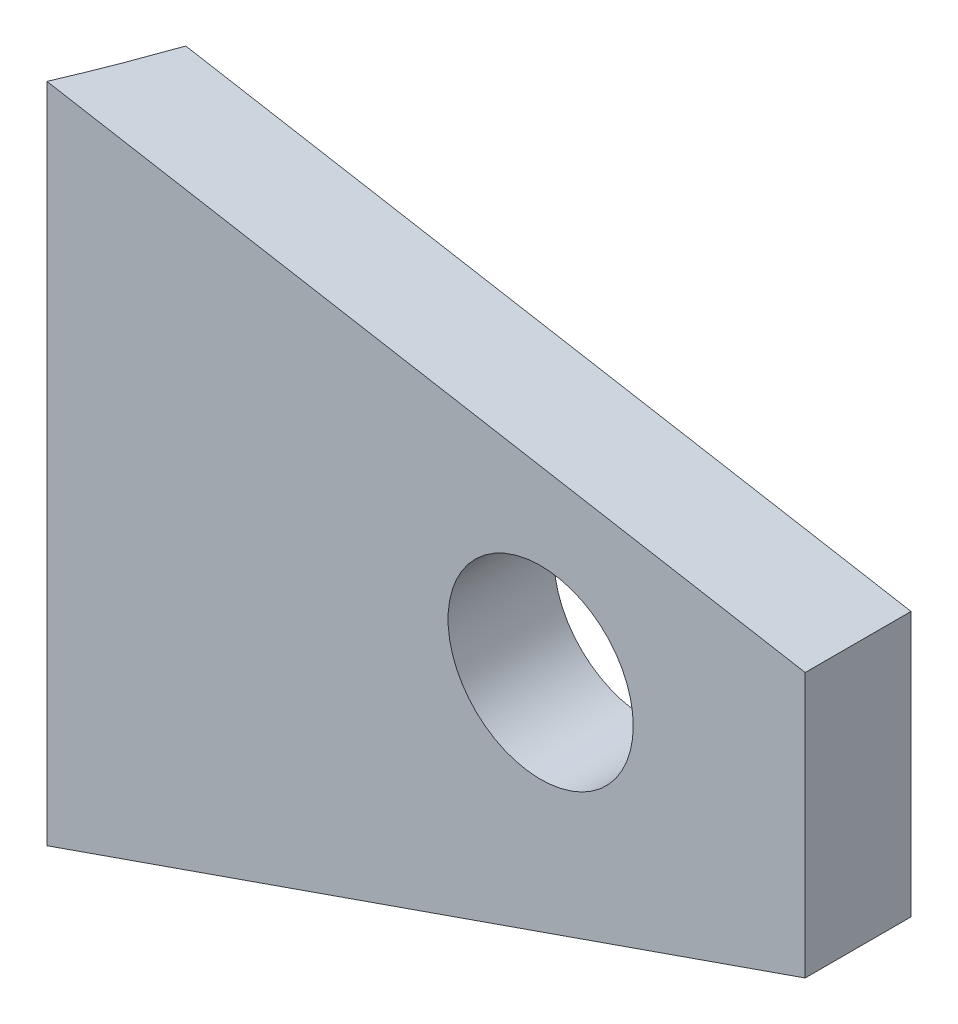
ISO-10303-21;
HEADER;
FILE_DESCRIPTION(('STEP AP214'),'2;1');
FILE_NAME('part.step','',(''),(''),'','','');
FILE_SCHEMA(('AUTOMOTIVE_DESIGN { 1 0 10303 214 1 1 1 1 }'));
ENDSEC;
DATA;
#1=APPLICATION_CONTEXT('core data for automotive mechanical design processes');
#2=APPLICATION_PROTOCOL_DEFINITION('international standard','automotive_design',2000,#1);
#3=PRODUCT_CONTEXT('',#1,'mechanical');
#4=PRODUCT('Part','Part','',(#3));
#5=PRODUCT_RELATED_PRODUCT_CATEGORY('part','',(#4));
#6=PRODUCT_DEFINITION_FORMATION('','',#4);
#7=PRODUCT_DEFINITION_CONTEXT('part definition',#1,'design');
#8=PRODUCT_DEFINITION('design','',#6,#7);
#9=PRODUCT_DEFINITION_SHAPE('','',#8);
#10=(LENGTH_UNIT() NAMED_UNIT(*) SI_UNIT(.MILLI.,.METRE.));
#11=(NAMED_UNIT(*) PLANE_ANGLE_UNIT() SI_UNIT($,.RADIAN.));
#12=(NAMED_UNIT(*) SI_UNIT($,.STERADIAN.) SOLID_ANGLE_UNIT());
#13=UNCERTAINTY_MEASURE_WITH_UNIT(LENGTH_MEASURE(1.E-05),#10,'distance_accuracy_value','');
#14=(GEOMETRIC_REPRESENTATION_CONTEXT(3) GLOBAL_UNCERTAINTY_ASSIGNED_CONTEXT((#13)) GLOBAL_UNIT_ASSIGNED_CONTEXT((#10,
#11,#12)) REPRESENTATION_CONTEXT('',''));
#15=CARTESIAN_POINT('',(0.,0.,0.));
#16=DIRECTION('',(0.,0.,1.));
#17=DIRECTION('',(1.,0.,0.));
#18=AXIS2_PLACEMENT_3D('',#15,#16,#17);
#19=CARTESIAN_POINT('',(0.,0.,2.));
#20=DIRECTION('',(0.,0.,1.));
#21=DIRECTION('',(1.,0.,0.));
#22=AXIS2_PLACEMENT_3D('',#19,#20,#21);
#23=PLANE('',#22);
#24=DIRECTION('',(-0.98500419469347,0.172530392789993,0.));
#25=VECTOR('',#24,1.);
#26=CARTESIAN_POINT('',(5.,2.5,2.));
#27=LINE('',#26,#25);
#28=CARTESIAN_POINT('',(5.,2.5,2.));
#29=VERTEX_POINT('',#28);
#30=CARTESIAN_POINT('',(-9.33000000000001,5.01,2.00000000000002));
#31=VERTEX_POINT('',#30);
#32=EDGE_CURVE('E78',#29,#31,#27,.T.);
#33=ORIENTED_EDGE('',*,*,#32,.T.);
#34=DIRECTION('',(0.,-1.,0.));
#35=VECTOR('',#34,1.);
#36=CARTESIAN_POINT('',(-9.33,5.01,2.));
#37=LINE('',#36,#35);
#38=CARTESIAN_POINT('',(-9.33,-7.5,2.));
#39=VERTEX_POINT('',#38);
#40=EDGE_CURVE('E98',#31,#39,#37,.T.);
#41=ORIENTED_EDGE('',*,*,#40,.T.);
#42=DIRECTION('',(0.944176352519815,0.329440457962252,0.));
#43=VECTOR('',#42,1.);
#44=CARTESIAN_POINT('',(-9.33,-7.5,2.));
#45=LINE('',#44,#43);
#46=CARTESIAN_POINT('',(5.,-2.5,2.));
#47=VERTEX_POINT('',#46);
#48=EDGE_CURVE('E96',#39,#47,#45,.T.);
#49=ORIENTED_EDGE('',*,*,#48,.T.);
#50=DIRECTION('',(0.,1.,0.));
#51=VECTOR('',#50,1.);
#52=CARTESIAN_POINT('',(5.,-2.5,2.));
#53=LINE('',#52,#51);
#54=EDGE_CURVE('E56',#47,#29,#53,.T.);
#55=ORIENTED_EDGE('',*,*,#54,.T.);
#56=EDGE_LOOP('',(#33,#41,#49,#55));
#57=FACE_BOUND('',#56,.T.);
#58=CARTESIAN_POINT('',(0.,0.,2.));
#59=DIRECTION('',(0.,0.,1.));
#60=DIRECTION('',(1.,0.,0.));
#61=AXIS2_PLACEMENT_3D('',#58,#59,#60);
#62=CIRCLE('',#61,1.75);
#63=CARTESIAN_POINT('',(1.75,0.,2.));
#64=VERTEX_POINT('',#63);
#65=EDGE_CURVE('E88',#64,#64,#62,.T.);
#66=ORIENTED_EDGE('',*,*,#65,.F.);
#67=EDGE_LOOP('',(#66));
#68=FACE_BOUND('',#67,.T.);
#69=ADVANCED_FACE('F33',(#57,#68),#23,.T.);
#70=CARTESIAN_POINT('',(0.,0.,0.));
#71=DIRECTION('',(0.,0.,1.));
#72=DIRECTION('',(1.,0.,0.));
#73=AXIS2_PLACEMENT_3D('',#70,#71,#72);
#74=PLANE('',#73);
#75=DIRECTION('',(0.944176352519815,0.329440457962252,0.));
#76=VECTOR('',#75,1.);
#77=CARTESIAN_POINT('',(-9.33,-7.5,0.));
#78=LINE('',#77,#76);
#79=CARTESIAN_POINT('',(-8.70697373888624,-7.28261470303079,0.));
#80=VERTEX_POINT('',#79);
#81=CARTESIAN_POINT('',(5.,-2.5,0.));
#82=VERTEX_POINT('',#81);
#83=EDGE_CURVE('E79',#80,#82,#78,.T.);
#84=ORIENTED_EDGE('',*,*,#83,.F.);
#85=DIRECTION('',(0.,1.,0.));
#86=VECTOR('',#85,1.);
#87=CARTESIAN_POINT('',(-8.70697373888624,-7.5,0.));
#88=LINE('',#87,#86);
#89=CARTESIAN_POINT('',(-8.70697373888624,4.90087258092145,0.));
#90=VERTEX_POINT('',#89);
#91=EDGE_CURVE('E48',#80,#90,#88,.T.);
#92=ORIENTED_EDGE('',*,*,#91,.T.);
#93=DIRECTION('',(-0.98500419469347,0.172530392789993,0.));
#94=VECTOR('',#93,1.);
#95=CARTESIAN_POINT('',(5.,2.5,0.));
#96=LINE('',#95,#94);
#97=CARTESIAN_POINT('',(5.,2.5,0.));
#98=VERTEX_POINT('',#97);
#99=EDGE_CURVE('E84',#98,#90,#96,.T.);
#100=ORIENTED_EDGE('',*,*,#99,.F.);
#101=DIRECTION('',(0.,1.,0.));
#102=VECTOR('',#101,1.);
#103=CARTESIAN_POINT('',(5.,-2.5,0.));
#104=LINE('',#103,#102);
#105=EDGE_CURVE('E69',#82,#98,#104,.T.);
#106=ORIENTED_EDGE('',*,*,#105,.F.);
#107=EDGE_LOOP('',(#84,#92,#100,#106));
#108=FACE_BOUND('',#107,.T.);
#109=CARTESIAN_POINT('',(0.,0.,0.));
#110=DIRECTION('',(0.,0.,1.));
#111=DIRECTION('',(1.,0.,0.));
#112=AXIS2_PLACEMENT_3D('',#109,#110,#111);
#113=CIRCLE('',#112,1.75);
#114=CARTESIAN_POINT('',(1.75,0.,0.));
#115=VERTEX_POINT('',#114);
#116=EDGE_CURVE('E92',#115,#115,#113,.T.);
#117=ORIENTED_EDGE('',*,*,#116,.T.);
#118=EDGE_LOOP('',(#117));
#119=FACE_BOUND('',#118,.T.);
#120=ADVANCED_FACE('F86',(#108,#119),#74,.F.);
#121=CARTESIAN_POINT('',(5.,2.5,2.));
#122=DIRECTION('',(-0.172530392789993,-0.98500419469347,0.));
#123=DIRECTION('',(0.98500419469347,-0.172530392789993,0.));
#124=AXIS2_PLACEMENT_3D('',#121,#122,#123);
#125=PLANE('',#124);
#126=ORIENTED_EDGE('',*,*,#99,.T.);
#127=CARTESIAN_POINT('',(-44.33,11.1404954640614,-10.));
#128=DIRECTION('',(-0.172530392789993,-0.98500419469347,0.));
#129=DIRECTION('',(-0.98500419469347,0.172530392789993,0.));
#130=AXIS2_PLACEMENT_3D('',#127,#128,#129);
#131=ELLIPSE('',#130,37.5632918106651,37.);
#132=EDGE_CURVE('E105',#90,#31,#131,.T.);
#133=ORIENTED_EDGE('',*,*,#132,.T.);
#134=ORIENTED_EDGE('',*,*,#32,.F.);
#135=DIRECTION('',(0.,0.,-1.));
#136=VECTOR('',#135,1.);
#137=CARTESIAN_POINT('',(5.,2.5,2.));
#138=LINE('',#137,#136);
#139=EDGE_CURVE('E72',#29,#98,#138,.T.);
#140=ORIENTED_EDGE('',*,*,#139,.T.);
#141=EDGE_LOOP('',(#126,#133,#134,#140));
#142=FACE_BOUND('',#141,.T.);
#143=ADVANCED_FACE('F35',(#142),#125,.F.);
#144=CARTESIAN_POINT('',(-9.33,-7.5,2.));
#145=DIRECTION('',(-0.329440457962252,0.944176352519815,0.));
#146=DIRECTION('',(-0.944176352519815,-0.329440457962252,0.));
#147=AXIS2_PLACEMENT_3D('',#144,#145,#146);
#148=PLANE('',#147);
#149=ORIENTED_EDGE('',*,*,#48,.F.);
#150=CARTESIAN_POINT('',(-44.33,-19.7121423586881,-10.));
#151=DIRECTION('',(-0.329440457962252,0.944176352519815,0.));
#152=DIRECTION('',(0.944176352519815,0.329440457962252,0.));
#153=AXIS2_PLACEMENT_3D('',#150,#151,#152);
#154=ELLIPSE('',#153,39.1875944586565,37.);
#155=EDGE_CURVE('E11',#39,#80,#154,.T.);
#156=ORIENTED_EDGE('',*,*,#155,.T.);
#157=ORIENTED_EDGE('',*,*,#83,.T.);
#158=DIRECTION('',(0.,0.,-1.));
#159=VECTOR('',#158,1.);
#160=CARTESIAN_POINT('',(5.,-2.5,2.));
#161=LINE('',#160,#159);
#162=EDGE_CURVE('E41',#47,#82,#161,.T.);
#163=ORIENTED_EDGE('',*,*,#162,.F.);
#164=EDGE_LOOP('',(#149,#156,#157,#163));
#165=FACE_BOUND('',#164,.T.);
#166=ADVANCED_FACE('F114',(#165),#148,.F.);
#167=CARTESIAN_POINT('',(5.,-2.5,2.));
#168=DIRECTION('',(-1.,0.,0.));
#169=DIRECTION('',(0.,0.,1.));
#170=AXIS2_PLACEMENT_3D('',#167,#168,#169);
#171=PLANE('',#170);
#172=ORIENTED_EDGE('',*,*,#105,.T.);
#173=ORIENTED_EDGE('',*,*,#139,.F.);
#174=ORIENTED_EDGE('',*,*,#54,.F.);
#175=ORIENTED_EDGE('',*,*,#162,.T.);
#176=EDGE_LOOP('',(#172,#173,#174,#175));
#177=FACE_BOUND('',#176,.T.);
#178=ADVANCED_FACE('F71',(#177),#171,.F.);
#179=CARTESIAN_POINT('',(0.,0.,2.));
#180=DIRECTION('',(0.,0.,-1.));
#181=DIRECTION('',(-1.,0.,0.));
#182=AXIS2_PLACEMENT_3D('',#179,#180,#181);
#183=CYLINDRICAL_SURFACE('',#182,1.75);
#184=ORIENTED_EDGE('',*,*,#65,.T.);
#185=EDGE_LOOP('',(#184));
#186=FACE_BOUND('',#185,.T.);
#187=ORIENTED_EDGE('',*,*,#116,.F.);
#188=EDGE_LOOP('',(#187));
#189=FACE_BOUND('',#188,.T.);
#190=ADVANCED_FACE('F117',(#186,#189),#183,.F.);
#191=CARTESIAN_POINT('',(-44.33,-7.5,-10.));
#192=DIRECTION('',(0.,1.,0.));
#193=DIRECTION('',(0.,0.,1.));
#194=AXIS2_PLACEMENT_3D('',#191,#192,#193);
#195=CYLINDRICAL_SURFACE('',#194,37.);
#196=ORIENTED_EDGE('',*,*,#155,.F.);
#197=ORIENTED_EDGE('',*,*,#40,.F.);
#198=ORIENTED_EDGE('',*,*,#132,.F.);
#199=ORIENTED_EDGE('',*,*,#91,.F.);
#200=EDGE_LOOP('',(#196,#197,#198,#199));
#201=FACE_BOUND('',#200,.T.);
#202=ADVANCED_FACE('F115',(#201),#195,.F.);
#203=CLOSED_SHELL('',(#69,#120,#143,#166,#178,#190,#202));
#204=MANIFOLD_SOLID_BREP('B2',#203);
#205=ADVANCED_BREP_SHAPE_REPRESENTATION('',(#18,#204),#14);
#206=SHAPE_DEFINITION_REPRESENTATION(#9,#205);
ENDSEC;
END-ISO-10303-21;
